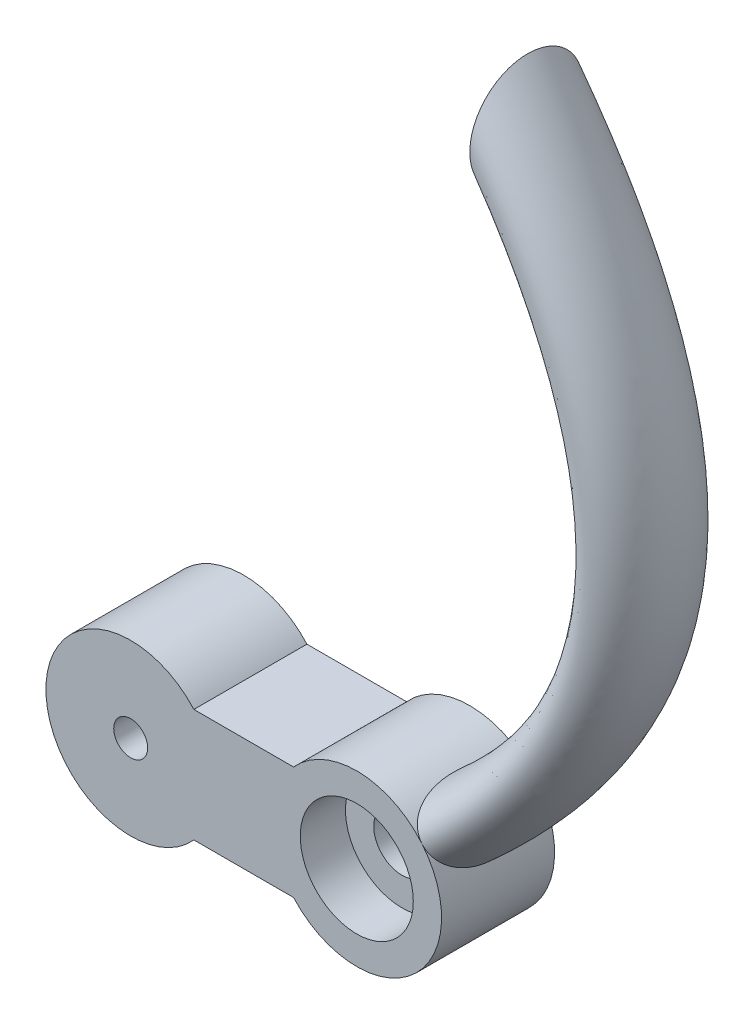
ISO-10303-21;
HEADER;
FILE_DESCRIPTION(('STEP AP214'),'2;1');
FILE_NAME('part.step','',(''),(''),'','','');
FILE_SCHEMA(('AUTOMOTIVE_DESIGN { 1 0 10303 214 1 1 1 1 }'));
ENDSEC;
DATA;
#1=APPLICATION_CONTEXT('core data for automotive mechanical design processes');
#2=APPLICATION_PROTOCOL_DEFINITION('international standard','automotive_design',2000,#1);
#3=PRODUCT_CONTEXT('',#1,'mechanical');
#4=PRODUCT('Part','Part','',(#3));
#5=PRODUCT_RELATED_PRODUCT_CATEGORY('part','',(#4));
#6=PRODUCT_DEFINITION_FORMATION('','',#4);
#7=PRODUCT_DEFINITION_CONTEXT('part definition',#1,'design');
#8=PRODUCT_DEFINITION('design','',#6,#7);
#9=PRODUCT_DEFINITION_SHAPE('','',#8);
#10=(LENGTH_UNIT() NAMED_UNIT(*) SI_UNIT(.MILLI.,.METRE.));
#11=(NAMED_UNIT(*) PLANE_ANGLE_UNIT() SI_UNIT($,.RADIAN.));
#12=(NAMED_UNIT(*) SI_UNIT($,.STERADIAN.) SOLID_ANGLE_UNIT());
#13=UNCERTAINTY_MEASURE_WITH_UNIT(LENGTH_MEASURE(1.E-05),#10,'distance_accuracy_value','');
#14=(GEOMETRIC_REPRESENTATION_CONTEXT(3) GLOBAL_UNCERTAINTY_ASSIGNED_CONTEXT((#13)) GLOBAL_UNIT_ASSIGNED_CONTEXT((#10,
#11,#12)) REPRESENTATION_CONTEXT('',''));
#15=CARTESIAN_POINT('',(0.,0.,0.));
#16=DIRECTION('',(0.,0.,1.));
#17=DIRECTION('',(1.,0.,0.));
#18=AXIS2_PLACEMENT_3D('',#15,#16,#17);
#19=CARTESIAN_POINT('',(10.,0.,5.));
#20=DIRECTION('',(0.,0.,-1.));
#21=DIRECTION('',(-1.,0.,0.));
#22=AXIS2_PLACEMENT_3D('',#19,#20,#21);
#23=CYLINDRICAL_SURFACE('',#22,2.5);
#24=CARTESIAN_POINT('',(10.,0.,1.));
#25=DIRECTION('',(0.,0.,1.));
#26=DIRECTION('',(1.,0.,0.));
#27=AXIS2_PLACEMENT_3D('',#24,#25,#26);
#28=CIRCLE('',#27,2.5);
#29=CARTESIAN_POINT('',(12.5,0.,1.));
#30=VERTEX_POINT('',#29);
#31=EDGE_CURVE('E99',#30,#30,#28,.T.);
#32=ORIENTED_EDGE('',*,*,#31,.T.);
#33=EDGE_LOOP('',(#32));
#34=FACE_BOUND('',#33,.T.);
#35=CARTESIAN_POINT('',(10.,0.,-5.));
#36=DIRECTION('',(0.,0.,1.));
#37=DIRECTION('',(1.,0.,0.));
#38=AXIS2_PLACEMENT_3D('',#35,#36,#37);
#39=CIRCLE('',#38,2.5);
#40=CARTESIAN_POINT('',(12.5,0.,-5.));
#41=VERTEX_POINT('',#40);
#42=EDGE_CURVE('E198',#41,#41,#39,.T.);
#43=ORIENTED_EDGE('',*,*,#42,.F.);
#44=EDGE_LOOP('',(#43));
#45=FACE_BOUND('',#44,.T.);
#46=ADVANCED_FACE('F36',(#34,#45),#23,.F.);
#47=CARTESIAN_POINT('',(10.,0.,5.));
#48=DIRECTION('',(0.,0.,-1.));
#49=DIRECTION('',(-1.,0.,0.));
#50=AXIS2_PLACEMENT_3D('',#47,#48,#49);
#51=CYLINDRICAL_SURFACE('',#50,7.5);
#52=CARTESIAN_POINT('',(10.,0.,5.));
#53=DIRECTION('',(0.,0.,1.));
#54=DIRECTION('',(1.,0.,0.));
#55=AXIS2_PLACEMENT_3D('',#52,#53,#54);
#56=CIRCLE('',#55,7.5);
#57=CARTESIAN_POINT('',(15.7694044749905,4.79207387296563,5.));
#58=VERTEX_POINT('',#57);
#59=CARTESIAN_POINT('',(4.40983005625052,5.,5.));
#60=VERTEX_POINT('',#59);
#61=EDGE_CURVE('E60',#58,#60,#56,.T.);
#62=ORIENTED_EDGE('',*,*,#61,.F.);
#63=CARTESIAN_POINT('',(15.7694044749901,4.7920738729637,5.));
#64=CARTESIAN_POINT('',(15.7360705742699,4.83220729680182,5.00000237724048));
#65=CARTESIAN_POINT('',(15.7023238251322,4.87198180652238,4.99775538170766));
#66=CARTESIAN_POINT('',(15.6342598605848,4.950536726728,4.98875693076937));
#67=CARTESIAN_POINT('',(15.5999425800358,4.98931702239794,4.98200495752584));
#68=CARTESIAN_POINT('',(15.5310230473899,5.06561232602957,4.96407519487218));
#69=CARTESIAN_POINT('',(15.496420665983,5.10312671549396,4.9528952750798));
#70=CARTESIAN_POINT('',(15.4272327826365,5.17664931994343,4.92629932449634));
#71=CARTESIAN_POINT('',(15.392647292964,5.21265692718187,4.91088160304595));
#72=CARTESIAN_POINT('',(15.2898029991921,5.31766041125311,4.8588776206783));
#73=CARTESIAN_POINT('',(15.2219431406473,5.38420164073377,4.81640206713148));
#74=CARTESIAN_POINT('',(15.0890460374641,5.50999416824557,4.71823006404527));
#75=CARTESIAN_POINT('',(15.024013653487,5.56923321088768,4.66251183581868));
#76=CARTESIAN_POINT('',(14.9121201649788,5.66791969578116,4.5543404313291));
#77=CARTESIAN_POINT('',(14.864470128819,5.70881671927045,4.50398775548582));
#78=CARTESIAN_POINT('',(14.7717967270433,5.78650237518905,4.39810298029026));
#79=CARTESIAN_POINT('',(14.7267710294031,5.82329468255169,4.34257559693056));
#80=CARTESIAN_POINT('',(14.6393005711655,5.89321942375637,4.22707148691278));
#81=CARTESIAN_POINT('',(14.5968632450052,5.92634151968345,4.16708294982884));
#82=CARTESIAN_POINT('',(14.5147185644239,5.98915582320375,4.04353721645728));
#83=CARTESIAN_POINT('',(14.4750121226916,6.01884688634512,3.97997883986263));
#84=CARTESIAN_POINT('',(14.3743754249286,6.09268626841556,3.80933888890256));
#85=CARTESIAN_POINT('',(14.3156606550708,6.13429619514976,3.69984493754626));
#86=CARTESIAN_POINT('',(14.2051244124372,6.21059026948541,3.47512363616471));
#87=CARTESIAN_POINT('',(14.1533066020508,6.24527074230227,3.35989328429343));
#88=CARTESIAN_POINT('',(14.0561958465296,6.3087752011365,3.12498228428473));
#89=CARTESIAN_POINT('',(14.0109117293368,6.33759128470812,3.00529588489212));
#90=CARTESIAN_POINT('',(13.9266349340324,6.39014822253349,2.76262433742069));
#91=CARTESIAN_POINT('',(13.8876444300444,6.41388732386424,2.63963806644143));
#92=CARTESIAN_POINT('',(13.7935649811109,6.47020060193488,2.31475088207338));
#93=CARTESIAN_POINT('',(13.7433168757188,6.49923333738147,2.11082076846375));
#94=CARTESIAN_POINT('',(13.6576449075285,6.54782627951535,1.69872733082844));
#95=CARTESIAN_POINT('',(13.6222297729164,6.56738091004914,1.49056158975005));
#96=CARTESIAN_POINT('',(13.5656074352092,6.59829401625841,1.07131312672707));
#97=CARTESIAN_POINT('',(13.5444276286704,6.60963669085726,0.860225573514235));
#98=CARTESIAN_POINT('',(13.5160504389127,6.62477487368972,0.436909342889056));
#99=CARTESIAN_POINT('',(13.508849858629,6.62857210757885,0.224680937527231));
#100=CARTESIAN_POINT('',(13.5082970558608,6.62886541013109,-0.208042998011771));
#101=CARTESIAN_POINT('',(13.5154931273328,6.62507240451214,-0.428539717129851));
#102=CARTESIAN_POINT('',(13.5449662126432,6.60934915104796,-0.868315814337598));
#103=CARTESIAN_POINT('',(13.5672481791782,6.59741623086055,-1.08759476879213));
#104=CARTESIAN_POINT('',(13.6271930419613,6.56465106363896,-1.52270206037956));
#105=CARTESIAN_POINT('',(13.6648074830864,6.5438468430549,-1.73853906233697));
#106=CARTESIAN_POINT('',(13.7560531939875,6.49190502603657,-2.16539761524114));
#107=CARTESIAN_POINT('',(13.809671431472,6.46077583519778,-2.37642293453028));
#108=CARTESIAN_POINT('',(13.9315011143347,6.38734668644009,-2.78295057069135));
#109=CARTESIAN_POINT('',(13.9990421130395,6.34554403812623,-2.97873609977285));
#110=CARTESIAN_POINT('',(14.1130228191281,6.27176647369967,-3.26449598134305));
#111=CARTESIAN_POINT('',(14.1531390564861,6.24532068726002,-3.35845110760991));
#112=CARTESIAN_POINT('',(14.2377760275465,6.18820431771062,-3.54304917265364));
#113=CARTESIAN_POINT('',(14.2822961552163,6.15753431568052,-3.63369256482377));
#114=CARTESIAN_POINT('',(14.3680236132018,6.09693680301037,-3.7958831081099));
#115=CARTESIAN_POINT('',(14.4085272518486,6.06775322601991,-3.86807648932127));
#116=CARTESIAN_POINT('',(14.4927503445434,6.00565793862355,-4.00889454123532));
#117=CARTESIAN_POINT('',(14.5364706668637,5.97274522031492,-4.07751823978581));
#118=CARTESIAN_POINT('',(14.6723993505548,5.86786435251672,-4.27663204152525));
#119=CARTESIAN_POINT('',(14.7695875693868,5.78960778344394,-4.40077586502337));
#120=CARTESIAN_POINT('',(14.9412766646349,5.64285753012954,-4.58516601165053));
#121=CARTESIAN_POINT('',(15.0124414187169,5.57990521444296,-4.65287254407982));
#122=CARTESIAN_POINT('',(15.1221815352843,5.47866149614982,-4.74283705794195));
#123=CARTESIAN_POINT('',(15.159226804485,5.44381106333318,-4.7708732740929));
#124=CARTESIAN_POINT('',(15.2341043907137,5.37185658459617,-4.82264960957925));
#125=CARTESIAN_POINT('',(15.271936329151,5.33475360694927,-4.84639174445812));
#126=CARTESIAN_POINT('',(15.3477868487051,5.25871040804303,-4.88895864833734));
#127=CARTESIAN_POINT('',(15.3858012089766,5.21978818858261,-4.90782295788634));
#128=CARTESIAN_POINT('',(15.4620030646276,5.13999667602533,-4.94051763218561));
#129=CARTESIAN_POINT('',(15.5001906282308,5.09912654190484,-4.95434579987386));
#130=CARTESIAN_POINT('',(15.5710643081979,5.02151451627252,-4.97512529929515));
#131=CARTESIAN_POINT('',(15.6037807356745,4.98498359128032,-4.9827632857917));
#132=CARTESIAN_POINT('',(15.6687876674215,4.91093484007519,-4.99398912326325));
#133=CARTESIAN_POINT('',(15.7010780953748,4.87341684053951,-4.99757625801667));
#134=CARTESIAN_POINT('',(15.7969753351866,4.75971224708958,-5.00219959928699));
#135=CARTESIAN_POINT('',(15.8596137272951,4.68236890945907,-4.99709938730061));
#136=CARTESIAN_POINT('',(15.9806913031794,4.5267123233976,-4.97131779004542));
#137=CARTESIAN_POINT('',(16.0391154556434,4.44839666849187,-4.9505833872398));
#138=CARTESIAN_POINT('',(16.1507041649268,4.29278732748403,-4.89529794135457));
#139=CARTESIAN_POINT('',(16.2038609116861,4.21549530189426,-4.86072675367747));
#140=CARTESIAN_POINT('',(16.2914384697034,4.08318185823935,-4.79046364900805));
#141=CARTESIAN_POINT('',(16.327142871011,4.02758365557693,-4.75738800075506));
#142=CARTESIAN_POINT('',(16.3954765964597,3.91816702604437,-4.68576012466214));
#143=CARTESIAN_POINT('',(16.4281086444641,3.86434705066018,-4.64721282535048));
#144=CARTESIAN_POINT('',(16.5217922679563,3.70558531428068,-4.52427721772605));
#145=CARTESIAN_POINT('',(16.5784863783052,3.60356414042665,-4.43271831673645));
#146=CARTESIAN_POINT('',(16.6690520187371,3.43230425997055,-4.25973689689905));
#147=CARTESIAN_POINT('',(16.7051195751152,3.36113120690249,-4.18127310683882));
#148=CARTESIAN_POINT('',(16.7721509176045,3.22394131074057,-4.01785898154596));
#149=CARTESIAN_POINT('',(16.8031125765543,3.15792662266244,-3.93290596430192));
#150=CARTESIAN_POINT('',(16.8605837947058,3.03104756454103,-3.75764976067525));
#151=CARTESIAN_POINT('',(16.8870869702955,2.97019064011982,-3.66733914925288));
#152=CARTESIAN_POINT('',(16.93616914576,2.85369039819319,-3.48237985993049));
#153=CARTESIAN_POINT('',(16.9587470218858,2.79804857578038,-3.38772994952828));
#154=CARTESIAN_POINT('',(17.0106057008888,2.66619552774649,-3.14799250802819));
#155=CARTESIAN_POINT('',(17.037818756946,2.59311360248537,-3.00072795907952));
#156=CARTESIAN_POINT('',(17.0860256192227,2.45832381963131,-2.70008366924021));
#157=CARTESIAN_POINT('',(17.1070166208278,2.39662109597679,-2.54670120591124));
#158=CARTESIAN_POINT('',(17.1438237188676,2.28456995032729,-2.23520430603324));
#159=CARTESIAN_POINT('',(17.1596383030126,2.23422484779245,-2.07708850133834));
#160=CARTESIAN_POINT('',(17.1868919114098,2.14493840645235,-1.75733917594015));
#161=CARTESIAN_POINT('',(17.1983315298116,2.10599551931816,-1.59570613605439));
#162=CARTESIAN_POINT('',(17.2177051374383,2.03862603074903,-1.26536850100332));
#163=CARTESIAN_POINT('',(17.225533025455,2.01052127769755,-1.09659214266593));
#164=CARTESIAN_POINT('',(17.2376513039045,1.96644981283084,-0.757336157585519));
#165=CARTESIAN_POINT('',(17.2419415697484,1.9504835285127,-0.586856471068271));
#166=CARTESIAN_POINT('',(17.2472340399364,1.93072635404102,-0.245071752989593));
#167=CARTESIAN_POINT('',(17.2482348892131,1.92694048159273,-0.0737664103951227));
#168=CARTESIAN_POINT('',(17.2470026861844,1.93156799100294,0.268669934495325));
#169=CARTESIAN_POINT('',(17.2447695046234,1.93998186045263,0.439800929549537));
#170=CARTESIAN_POINT('',(17.2364022504926,1.97098628990027,0.804447161388899));
#171=CARTESIAN_POINT('',(17.2297736369942,1.99536847595489,0.997801859033202));
#172=CARTESIAN_POINT('',(17.2116715150376,2.05983335873069,1.38170713077285));
#173=CARTESIAN_POINT('',(17.2001966811933,2.09992035032001,1.57225692299432));
#174=CARTESIAN_POINT('',(17.1715763651956,2.19567501037321,1.94883095786881));
#175=CARTESIAN_POINT('',(17.1544349733825,2.25133143577552,2.13485836127637));
#176=CARTESIAN_POINT('',(17.1132792682572,2.37817505006549,2.50071004400531));
#177=CARTESIAN_POINT('',(17.0892689877121,2.44935312028704,2.68053789391088));
#178=CARTESIAN_POINT('',(17.0439040618364,2.57603692687642,2.96234670664953));
#179=CARTESIAN_POINT('',(17.0252514459232,2.62661573805311,3.06700064098704));
#180=CARTESIAN_POINT('',(16.9843635533765,2.73348571334548,3.27261549722381));
#181=CARTESIAN_POINT('',(16.9621292085547,2.78977539033344,3.37357737127861));
#182=CARTESIAN_POINT('',(16.9135657625219,2.90803902156832,3.57093879385311));
#183=CARTESIAN_POINT('',(16.8872417454087,2.97000587947508,3.66734381574725));
#184=CARTESIAN_POINT('',(16.8298596416592,3.09968353109019,3.85469135973373));
#185=CARTESIAN_POINT('',(16.7988031512846,3.16739238462285,3.94563570934396));
#186=CARTESIAN_POINT('',(16.7181130350588,3.33598521761579,4.15485296295627));
#187=CARTESIAN_POINT('',(16.6659454923903,3.43955274387845,4.27004885117847));
#188=CARTESIAN_POINT('',(16.5489455855814,3.65739406073176,4.48265713742125));
#189=CARTESIAN_POINT('',(16.4841302235882,3.77165337247536,4.58009307332958));
#190=CARTESIAN_POINT('',(16.3590498038969,3.97780354563421,4.72761580315644));
#191=CARTESIAN_POINT('',(16.3021227633146,4.06760819338094,4.78340879994918));
#192=CARTESIAN_POINT('',(16.1801607389554,4.25060068600979,4.87786792695158));
#193=CARTESIAN_POINT('',(16.1151451749953,4.34378006090881,4.91657410141825));
#194=CARTESIAN_POINT('',(16.0029251480228,4.49670298086836,4.96289009370077));
#195=CARTESIAN_POINT('',(15.9579046434066,4.55620957928409,4.97669565746212));
#196=CARTESIAN_POINT('',(15.8653480253328,4.67475441836803,4.99524950540743));
#197=CARTESIAN_POINT('',(15.8178115678926,4.7337925937177,4.99999654779974));
#198=CARTESIAN_POINT('',(15.7694044749901,4.7920738729637,5.));
#199=B_SPLINE_CURVE_WITH_KNOTS('',3,(#63,#64,#65,#66,#67,#68,#69,#70,#71,#72,#73,#74,#75,#76,
#77,#78,#79,#80,#81,#82,#83,#84,#85,#86,#87,#88,#89,#90,#91,#92,#93,#94,#95,#96,#97,#98,#99,
#100,#101,#102,#103,#104,#105,#106,#107,#108,#109,#110,#111,#112,#113,#114,#115,#116,#117,#118,
#119,#120,#121,#122,#123,#124,#125,#126,#127,#128,#129,#130,#131,#132,#133,#134,#135,#136,#137,
#138,#139,#140,#141,#142,#143,#144,#145,#146,#147,#148,#149,#150,#151,#152,#153,#154,#155,#156,
#157,#158,#159,#160,#161,#162,#163,#164,#165,#166,#167,#168,#169,#170,#171,#172,#173,#174,#175,
#176,#177,#178,#179,#180,#181,#182,#183,#184,#185,#186,#187,#188,#189,#190,#191,#192,#193,#194,
#195,#196,#197,#198),.UNSPECIFIED.,.T.,.F.,(4,2,2,2,2,2,2,2,2,2,2,2,2,2,2,2,2,2,2,2,2,2,2,2,2,2,
2,2,2,2,2,2,2,2,2,2,2,2,2,2,2,2,2,2,2,2,2,2,2,2,2,2,2,2,2,2,2,2,2,2,2,2,2,2,2,2,2,4),(0.,
0.156439971337123,0.31289792823076,0.469431252100811,0.626027115376447,0.936921934596182,
1.24833162809643,1.48946883562876,1.73038839165291,1.9719701658675,2.21363229066556,
2.60607802423842,2.99873132800393,3.39191029096186,3.78522478792438,4.42035605031446,
5.05586052060207,5.69258457347493,6.32916298967416,6.9904467296716,7.65194767434009,
8.31137409257003,8.97026498167302,9.60276781706127,9.91917093117886,10.2355305645319,
10.498641241557,10.7618232018618,11.2867449305404,11.6354543020296,11.8095057355777,
11.9834752601399,12.1559869085473,12.3285737268101,12.4772873658154,12.6260272944146,
12.923481998799,13.221949972189,13.5208540668264,13.7422332153375,13.963414209711,
14.4066433023103,14.7419692116626,15.0774344697085,15.4133760292471,15.7494136055475,
16.2486014197559,16.7480139037769,17.2475721611313,17.7470625510069,18.2604150993035,
18.7737857262027,19.2873678084209,19.8009704177123,20.3852542560413,20.9696979929257,
21.5537207736127,22.137401372128,22.4903564120593,22.843219776132,23.1956479354692,
23.5479574829553,24.0368764773258,24.5251427023578,24.8841464250431,25.2423042699963,
25.469453393202,25.6966336530152),.UNSPECIFIED.);
#200=CARTESIAN_POINT('',(15.7694043249585,4.79207405359617,-4.99999999999998));
#201=VERTEX_POINT('',#200);
#202=EDGE_CURVE('E51',#58,#201,#199,.T.);
#203=ORIENTED_EDGE('',*,*,#202,.T.);
#204=CARTESIAN_POINT('',(10.,0.,-5.));
#205=DIRECTION('',(0.,0.,1.));
#206=DIRECTION('',(1.,0.,0.));
#207=AXIS2_PLACEMENT_3D('',#204,#205,#206);
#208=CIRCLE('',#207,7.5);
#209=CARTESIAN_POINT('',(4.40983005625052,5.,-5.));
#210=VERTEX_POINT('',#209);
#211=EDGE_CURVE('E81',#201,#210,#208,.T.);
#212=ORIENTED_EDGE('',*,*,#211,.T.);
#213=DIRECTION('',(0.,0.,-1.));
#214=VECTOR('',#213,1.);
#215=CARTESIAN_POINT('',(4.40983005625052,5.,5.));
#216=LINE('',#215,#214);
#217=EDGE_CURVE('E190',#60,#210,#216,.T.);
#218=ORIENTED_EDGE('',*,*,#217,.F.);
#219=EDGE_LOOP('',(#62,#203,#212,#218));
#220=FACE_BOUND('',#219,.T.);
#221=ADVANCED_FACE('F152',(#220),#51,.T.);
#222=CARTESIAN_POINT('',(-10.,0.,5.));
#223=DIRECTION('',(0.,0.,-1.));
#224=DIRECTION('',(-1.,0.,0.));
#225=AXIS2_PLACEMENT_3D('',#222,#223,#224);
#226=CYLINDRICAL_SURFACE('',#225,1.5);
#227=CARTESIAN_POINT('',(-10.,0.,5.));
#228=DIRECTION('',(0.,0.,1.));
#229=DIRECTION('',(1.,0.,0.));
#230=AXIS2_PLACEMENT_3D('',#227,#228,#229);
#231=CIRCLE('',#230,1.5);
#232=CARTESIAN_POINT('',(-8.5,0.,5.));
#233=VERTEX_POINT('',#232);
#234=EDGE_CURVE('E189',#233,#233,#231,.T.);
#235=ORIENTED_EDGE('',*,*,#234,.T.);
#236=EDGE_LOOP('',(#235));
#237=FACE_BOUND('',#236,.T.);
#238=CARTESIAN_POINT('',(-10.,0.,-1.));
#239=DIRECTION('',(0.,0.,-1.));
#240=DIRECTION('',(-1.,0.,0.));
#241=AXIS2_PLACEMENT_3D('',#238,#239,#240);
#242=CIRCLE('',#241,1.5);
#243=CARTESIAN_POINT('',(-11.5,0.,-1.));
#244=VERTEX_POINT('',#243);
#245=EDGE_CURVE('E40',#244,#244,#242,.T.);
#246=ORIENTED_EDGE('',*,*,#245,.T.);
#247=EDGE_LOOP('',(#246));
#248=FACE_BOUND('',#247,.T.);
#249=ADVANCED_FACE('F38',(#237,#248),#226,.F.);
#250=CARTESIAN_POINT('',(0.,5.,5.));
#251=DIRECTION('',(0.,-1.,0.));
#252=DIRECTION('',(1.,0.,0.));
#253=AXIS2_PLACEMENT_3D('',#250,#251,#252);
#254=PLANE('',#253);
#255=DIRECTION('',(-1.,0.,0.));
#256=VECTOR('',#255,1.);
#257=CARTESIAN_POINT('',(0.,5.,-5.));
#258=LINE('',#257,#256);
#259=CARTESIAN_POINT('',(-4.40983005625053,5.,-5.));
#260=VERTEX_POINT('',#259);
#261=EDGE_CURVE('E184',#210,#260,#258,.T.);
#262=ORIENTED_EDGE('',*,*,#261,.T.);
#263=DIRECTION('',(0.,0.,-1.));
#264=VECTOR('',#263,1.);
#265=CARTESIAN_POINT('',(-4.40983005625053,5.,5.));
#266=LINE('',#265,#264);
#267=CARTESIAN_POINT('',(-4.40983005625053,5.,5.));
#268=VERTEX_POINT('',#267);
#269=EDGE_CURVE('E11',#268,#260,#266,.T.);
#270=ORIENTED_EDGE('',*,*,#269,.F.);
#271=DIRECTION('',(-1.,0.,0.));
#272=VECTOR('',#271,1.);
#273=CARTESIAN_POINT('',(0.,5.,5.));
#274=LINE('',#273,#272);
#275=EDGE_CURVE('E206',#60,#268,#274,.T.);
#276=ORIENTED_EDGE('',*,*,#275,.F.);
#277=ORIENTED_EDGE('',*,*,#217,.T.);
#278=EDGE_LOOP('',(#262,#270,#276,#277));
#279=FACE_BOUND('',#278,.T.);
#280=ADVANCED_FACE('F159',(#279),#254,.F.);
#281=CARTESIAN_POINT('',(-10.,0.,5.));
#282=DIRECTION('',(0.,0.,-1.));
#283=DIRECTION('',(-1.,0.,0.));
#284=AXIS2_PLACEMENT_3D('',#281,#282,#283);
#285=CYLINDRICAL_SURFACE('',#284,7.5);
#286=CARTESIAN_POINT('',(-10.,0.,-5.));
#287=DIRECTION('',(0.,0.,1.));
#288=DIRECTION('',(1.,0.,0.));
#289=AXIS2_PLACEMENT_3D('',#286,#287,#288);
#290=CIRCLE('',#289,7.5);
#291=CARTESIAN_POINT('',(-4.40983005625053,-5.,-5.));
#292=VERTEX_POINT('',#291);
#293=EDGE_CURVE('E180',#260,#292,#290,.T.);
#294=ORIENTED_EDGE('',*,*,#293,.T.);
#295=DIRECTION('',(0.,0.,-1.));
#296=VECTOR('',#295,1.);
#297=CARTESIAN_POINT('',(-4.40983005625053,-5.,5.));
#298=LINE('',#297,#296);
#299=CARTESIAN_POINT('',(-4.40983005625053,-5.,5.));
#300=VERTEX_POINT('',#299);
#301=EDGE_CURVE('E45',#300,#292,#298,.T.);
#302=ORIENTED_EDGE('',*,*,#301,.F.);
#303=CARTESIAN_POINT('',(-10.,0.,5.));
#304=DIRECTION('',(0.,0.,1.));
#305=DIRECTION('',(1.,0.,0.));
#306=AXIS2_PLACEMENT_3D('',#303,#304,#305);
#307=CIRCLE('',#306,7.5);
#308=EDGE_CURVE('E88',#268,#300,#307,.T.);
#309=ORIENTED_EDGE('',*,*,#308,.F.);
#310=ORIENTED_EDGE('',*,*,#269,.T.);
#311=EDGE_LOOP('',(#294,#302,#309,#310));
#312=FACE_BOUND('',#311,.T.);
#313=ADVANCED_FACE('F162',(#312),#285,.T.);
#314=CARTESIAN_POINT('',(0.,-5.,5.));
#315=DIRECTION('',(0.,-1.,0.));
#316=DIRECTION('',(0.,0.,-1.));
#317=AXIS2_PLACEMENT_3D('',#314,#315,#316);
#318=PLANE('',#317);
#319=DIRECTION('',(-1.,0.,0.));
#320=VECTOR('',#319,1.);
#321=CARTESIAN_POINT('',(0.,-5.,-5.));
#322=LINE('',#321,#320);
#323=CARTESIAN_POINT('',(4.40983005625053,-5.,-5.));
#324=VERTEX_POINT('',#323);
#325=EDGE_CURVE('E174',#324,#292,#322,.T.);
#326=ORIENTED_EDGE('',*,*,#325,.F.);
#327=DIRECTION('',(0.,0.,-1.));
#328=VECTOR('',#327,1.);
#329=CARTESIAN_POINT('',(4.40983005625053,-5.,5.));
#330=LINE('',#329,#328);
#331=CARTESIAN_POINT('',(4.40983005625053,-5.,5.));
#332=VERTEX_POINT('',#331);
#333=EDGE_CURVE('E176',#332,#324,#330,.T.);
#334=ORIENTED_EDGE('',*,*,#333,.F.);
#335=DIRECTION('',(-1.,0.,0.));
#336=VECTOR('',#335,1.);
#337=CARTESIAN_POINT('',(0.,-5.,5.));
#338=LINE('',#337,#336);
#339=EDGE_CURVE('E203',#332,#300,#338,.T.);
#340=ORIENTED_EDGE('',*,*,#339,.T.);
#341=ORIENTED_EDGE('',*,*,#301,.T.);
#342=EDGE_LOOP('',(#326,#334,#340,#341));
#343=FACE_BOUND('',#342,.T.);
#344=ADVANCED_FACE('F165',(#343),#318,.T.);
#345=EDGE_CURVE('E182',#324,#201,#208,.T.);
#346=ORIENTED_EDGE('',*,*,#345,.T.);
#347=EDGE_CURVE('E98',#201,#58,#199,.T.);
#348=ORIENTED_EDGE('',*,*,#347,.T.);
#349=EDGE_CURVE('E192',#332,#58,#56,.T.);
#350=ORIENTED_EDGE('',*,*,#349,.F.);
#351=ORIENTED_EDGE('',*,*,#333,.T.);
#352=EDGE_LOOP('',(#346,#348,#350,#351));
#353=FACE_BOUND('',#352,.T.);
#354=ADVANCED_FACE('F114',(#353),#51,.T.);
#355=CARTESIAN_POINT('',(0.,0.,5.));
#356=DIRECTION('',(0.,0.,1.));
#357=DIRECTION('',(1.,0.,0.));
#358=AXIS2_PLACEMENT_3D('',#355,#356,#357);
#359=PLANE('',#358);
#360=CARTESIAN_POINT('',(10.,0.,5.));
#361=DIRECTION('',(0.,0.,1.));
#362=DIRECTION('',(1.,0.,0.));
#363=AXIS2_PLACEMENT_3D('',#360,#361,#362);
#364=CIRCLE('',#363,5.);
#365=CARTESIAN_POINT('',(15.,0.,5.));
#366=VERTEX_POINT('',#365);
#367=EDGE_CURVE('E315',#366,#366,#364,.T.);
#368=ORIENTED_EDGE('',*,*,#367,.F.);
#369=EDGE_LOOP('',(#368));
#370=FACE_BOUND('',#369,.T.);
#371=ORIENTED_EDGE('',*,*,#349,.T.);
#372=ORIENTED_EDGE('',*,*,#61,.T.);
#373=ORIENTED_EDGE('',*,*,#275,.T.);
#374=ORIENTED_EDGE('',*,*,#308,.T.);
#375=ORIENTED_EDGE('',*,*,#339,.F.);
#376=EDGE_LOOP('',(#371,#372,#373,#374,#375));
#377=FACE_BOUND('',#376,.T.);
#378=ORIENTED_EDGE('',*,*,#234,.F.);
#379=EDGE_LOOP('',(#378));
#380=FACE_BOUND('',#379,.T.);
#381=ADVANCED_FACE('F143',(#370,#377,#380),#359,.T.);
#382=CARTESIAN_POINT('',(0.,0.,-5.));
#383=DIRECTION('',(0.,0.,1.));
#384=DIRECTION('',(1.,0.,0.));
#385=AXIS2_PLACEMENT_3D('',#382,#383,#384);
#386=PLANE('',#385);
#387=ORIENTED_EDGE('',*,*,#211,.F.);
#388=ORIENTED_EDGE('',*,*,#345,.F.);
#389=ORIENTED_EDGE('',*,*,#325,.T.);
#390=ORIENTED_EDGE('',*,*,#293,.F.);
#391=ORIENTED_EDGE('',*,*,#261,.F.);
#392=EDGE_LOOP('',(#387,#388,#389,#390,#391));
#393=FACE_BOUND('',#392,.T.);
#394=CARTESIAN_POINT('',(-10.,0.,-5.));
#395=DIRECTION('',(0.,0.,-1.));
#396=DIRECTION('',(-1.,0.,0.));
#397=AXIS2_PLACEMENT_3D('',#394,#395,#396);
#398=CIRCLE('',#397,5.);
#399=CARTESIAN_POINT('',(-15.,0.,-5.));
#400=VERTEX_POINT('',#399);
#401=EDGE_CURVE('E209',#400,#400,#398,.T.);
#402=ORIENTED_EDGE('',*,*,#401,.F.);
#403=EDGE_LOOP('',(#402));
#404=FACE_BOUND('',#403,.T.);
#405=ORIENTED_EDGE('',*,*,#42,.T.);
#406=EDGE_LOOP('',(#405));
#407=FACE_BOUND('',#406,.T.);
#408=ADVANCED_FACE('F141',(#393,#404,#407),#386,.F.);
#409=CARTESIAN_POINT('',(-10.,0.,-1.));
#410=DIRECTION('',(0.,0.,-1.));
#411=DIRECTION('',(-1.,0.,0.));
#412=AXIS2_PLACEMENT_3D('',#409,#410,#411);
#413=CYLINDRICAL_SURFACE('',#412,5.);
#414=CARTESIAN_POINT('',(-10.,0.,-1.));
#415=DIRECTION('',(0.,0.,-1.));
#416=DIRECTION('',(-1.,0.,0.));
#417=AXIS2_PLACEMENT_3D('',#414,#415,#416);
#418=CIRCLE('',#417,5.);
#419=CARTESIAN_POINT('',(-15.,0.,-1.));
#420=VERTEX_POINT('',#419);
#421=EDGE_CURVE('E112',#420,#420,#418,.T.);
#422=ORIENTED_EDGE('',*,*,#421,.F.);
#423=EDGE_LOOP('',(#422));
#424=FACE_BOUND('',#423,.T.);
#425=ORIENTED_EDGE('',*,*,#401,.T.);
#426=EDGE_LOOP('',(#425));
#427=FACE_BOUND('',#426,.T.);
#428=ADVANCED_FACE('F137',(#424,#427),#413,.F.);
#429=CARTESIAN_POINT('',(-10.,0.,-1.));
#430=DIRECTION('',(0.,0.,-1.));
#431=DIRECTION('',(-1.,0.,0.));
#432=AXIS2_PLACEMENT_3D('',#429,#430,#431);
#433=PLANE('',#432);
#434=ORIENTED_EDGE('',*,*,#245,.F.);
#435=EDGE_LOOP('',(#434));
#436=FACE_BOUND('',#435,.T.);
#437=ORIENTED_EDGE('',*,*,#421,.T.);
#438=EDGE_LOOP('',(#437));
#439=FACE_BOUND('',#438,.T.);
#440=ADVANCED_FACE('F134',(#436,#439),#433,.T.);
#441=CARTESIAN_POINT('',(20.,60.,0.));
#442=DIRECTION('',(-0.999744705090728,0.0225947923879401,0.));
#443=DIRECTION('',(0.,0.,1.));
#444=AXIS2_PLACEMENT_3D('',#441,#442,#443);
#445=PLANE('',#444);
#446=CARTESIAN_POINT('',(20.,60.,0.));
#447=DIRECTION('',(-0.999744705090728,0.0225947923879401,0.));
#448=DIRECTION('',(0.,0.,1.));
#449=AXIS2_PLACEMENT_3D('',#446,#447,#448);
#450=CIRCLE('',#449,5.);
#451=CARTESIAN_POINT('',(20.,60.,5.));
#452=VERTEX_POINT('',#451);
#453=EDGE_CURVE('E95',#452,#452,#450,.T.);
#454=ORIENTED_EDGE('',*,*,#453,.T.);
#455=EDGE_LOOP('',(#454));
#456=FACE_BOUND('',#455,.T.);
#457=ADVANCED_FACE('F96',(#456),#445,.T.);
#458=CARTESIAN_POINT('',(10.,0.,5.));
#459=CARTESIAN_POINT('',(15.7452428863918,4.34220648551298,5.));
#460=CARTESIAN_POINT('',(20.2625083845958,8.84886134966878,5.));
#461=CARTESIAN_POINT('',(25.1964405493955,15.8555162137947,5.));
#462=CARTESIAN_POINT('',(26.5340902572763,18.2321799298375,5.));
#463=CARTESIAN_POINT('',(28.5954009788793,23.0677315512109,5.));
#464=CARTESIAN_POINT('',(29.3190619926163,25.5266194565636,5.));
#465=CARTESIAN_POINT('',(30.1523953259497,30.5266194565548,5.));
#466=CARTESIAN_POINT('',(30.2620676455503,33.0677315512186,5.));
#467=CARTESIAN_POINT('',(29.8674235906053,38.2321799298298,5.));
#468=CARTESIAN_POINT('',(29.3631072160585,40.8555162137957,5.));
#469=CARTESIAN_POINT('',(26.9291750512697,48.8488613496667,5.));
#470=CARTESIAN_POINT('',(24.078576219732,54.3422064855312,5.));
#471=CARTESIAN_POINT('',(20.,60.,5.));
#472=CARTESIAN_POINT('',(20.,0.,5.));
#473=CARTESIAN_POINT('',(25.745242886626,5.14907315825611,5.));
#474=CARTESIAN_POINT('',(30.1768255610235,10.6791923105475,5.));
#475=CARTESIAN_POINT('',(34.5239451123453,19.5172927974179,5.));
#476=CARTESIAN_POINT('',(35.5857561278351,22.5496702554719,5.));
#477=CARTESIAN_POINT('',(36.8937303353692,28.6989931885811,5.));
#478=CARTESIAN_POINT('',(37.1381664761129,31.8134864191474,5.));
#479=CARTESIAN_POINT('',(36.8513475843656,37.9956976973588,5.));
#480=CARTESIAN_POINT('',(36.3224393137614,41.0602385702913,5.));
#481=CARTESIAN_POINT('',(34.6153501079049,47.0676463577616,5.));
#482=CARTESIAN_POINT('',(33.4403473568711,50.0114308637351,5.));
#483=CARTESIAN_POINT('',(29.1073280734891,58.7014899534701,5.));
#484=CARTESIAN_POINT('',(25.1645332864312,64.3202168465839,5.));
#485=CARTESIAN_POINT('',(20.2259479238794,69.9974470509073,5.));
#486=CARTESIAN_POINT('',(20.,0.,-5.));
#487=CARTESIAN_POINT('',(25.745242886626,5.14907315825611,-5.));
#488=CARTESIAN_POINT('',(30.1768255610235,10.6791923105475,-5.));
#489=CARTESIAN_POINT('',(34.5239451123453,19.5172927974179,-5.));
#490=CARTESIAN_POINT('',(35.5857561278351,22.5496702554719,-5.));
#491=CARTESIAN_POINT('',(36.8937303353692,28.6989931885811,-5.));
#492=CARTESIAN_POINT('',(37.1381664761129,31.8134864191474,-5.));
#493=CARTESIAN_POINT('',(36.8513475843656,37.9956976973588,-5.));
#494=CARTESIAN_POINT('',(36.3224393137614,41.0602385702913,-5.));
#495=CARTESIAN_POINT('',(34.6153501079049,47.0676463577616,-5.));
#496=CARTESIAN_POINT('',(33.4403473568711,50.0114308637351,-5.));
#497=CARTESIAN_POINT('',(29.1073280734891,58.7014899534701,-5.));
#498=CARTESIAN_POINT('',(25.1645332864312,64.3202168465839,-5.));
#499=CARTESIAN_POINT('',(20.2259479238794,69.9974470509073,-5.));
#500=CARTESIAN_POINT('',(10.,0.,-5.));
#501=CARTESIAN_POINT('',(15.7452428863918,4.34220648551298,-5.));
#502=CARTESIAN_POINT('',(20.2625083845958,8.84886134966878,-5.));
#503=CARTESIAN_POINT('',(25.1964405493955,15.8555162137947,-5.));
#504=CARTESIAN_POINT('',(26.5340902572763,18.2321799298375,-5.));
#505=CARTESIAN_POINT('',(28.5954009788793,23.0677315512109,-5.));
#506=CARTESIAN_POINT('',(29.3190619926163,25.5266194565636,-5.));
#507=CARTESIAN_POINT('',(30.1523953259497,30.5266194565548,-5.));
#508=CARTESIAN_POINT('',(30.2620676455503,33.0677315512186,-5.));
#509=CARTESIAN_POINT('',(29.8674235906053,38.2321799298298,-5.));
#510=CARTESIAN_POINT('',(29.3631072160585,40.8555162137957,-5.));
#511=CARTESIAN_POINT('',(26.9291750512697,48.8488613496667,-5.));
#512=CARTESIAN_POINT('',(24.078576219732,54.3422064855312,-5.));
#513=CARTESIAN_POINT('',(20.,60.,-5.));
#514=CARTESIAN_POINT('',(0.,0.,-5.));
#515=CARTESIAN_POINT('',(5.74524288615752,3.53533981276986,-5.));
#516=CARTESIAN_POINT('',(10.3481912081682,7.01853038879008,-5.));
#517=CARTESIAN_POINT('',(15.8689359864456,12.1937396301715,-5.));
#518=CARTESIAN_POINT('',(17.4824243867176,13.9146896042032,-5.));
#519=CARTESIAN_POINT('',(20.2970716223893,17.4364699138407,-5.));
#520=CARTESIAN_POINT('',(21.4999575091198,19.2397524939797,-5.));
#521=CARTESIAN_POINT('',(23.4534430675337,23.0575412157508,-5.));
#522=CARTESIAN_POINT('',(24.2016959773392,25.075224532146,-5.));
#523=CARTESIAN_POINT('',(25.1194970733057,29.3967135018981,-5.));
#524=CARTESIAN_POINT('',(25.2858670752459,31.6996015638564,-5.));
#525=CARTESIAN_POINT('',(24.7510220290504,38.9962327458633,-5.));
#526=CARTESIAN_POINT('',(22.9926191530328,44.3641961244784,-5.));
#527=CARTESIAN_POINT('',(19.7740520761206,50.0025529490927,-5.));
#528=CARTESIAN_POINT('',(0.,0.,5.));
#529=CARTESIAN_POINT('',(5.74524288615752,3.53533981276986,5.));
#530=CARTESIAN_POINT('',(10.3481912081682,7.01853038879008,5.));
#531=CARTESIAN_POINT('',(15.8689359864456,12.1937396301715,5.));
#532=CARTESIAN_POINT('',(17.4824243867176,13.9146896042032,5.));
#533=CARTESIAN_POINT('',(20.2970716223893,17.4364699138407,5.));
#534=CARTESIAN_POINT('',(21.4999575091198,19.2397524939797,5.));
#535=CARTESIAN_POINT('',(23.4534430675337,23.0575412157508,5.));
#536=CARTESIAN_POINT('',(24.2016959773392,25.075224532146,5.));
#537=CARTESIAN_POINT('',(25.1194970733057,29.3967135018981,5.));
#538=CARTESIAN_POINT('',(25.2858670752459,31.6996015638564,5.));
#539=CARTESIAN_POINT('',(24.7510220290504,38.9962327458633,5.));
#540=CARTESIAN_POINT('',(22.9926191530328,44.3641961244784,5.));
#541=CARTESIAN_POINT('',(19.7740520761206,50.0025529490927,5.));
#542=CARTESIAN_POINT('',(10.,0.,5.));
#543=CARTESIAN_POINT('',(15.7452428863918,4.34220648551298,5.));
#544=CARTESIAN_POINT('',(20.2625083845958,8.84886134966878,5.));
#545=CARTESIAN_POINT('',(25.1964405493955,15.8555162137947,5.));
#546=CARTESIAN_POINT('',(26.5340902572763,18.2321799298375,5.));
#547=CARTESIAN_POINT('',(28.5954009788793,23.0677315512109,5.));
#548=CARTESIAN_POINT('',(29.3190619926163,25.5266194565636,5.));
#549=CARTESIAN_POINT('',(30.1523953259497,30.5266194565548,5.));
#550=CARTESIAN_POINT('',(30.2620676455503,33.0677315512186,5.));
#551=CARTESIAN_POINT('',(29.8674235906053,38.2321799298298,5.));
#552=CARTESIAN_POINT('',(29.3631072160585,40.8555162137957,5.));
#553=CARTESIAN_POINT('',(26.9291750512697,48.8488613496667,5.));
#554=CARTESIAN_POINT('',(24.078576219732,54.3422064855312,5.));
#555=CARTESIAN_POINT('',(20.,60.,5.));
#556=(BOUNDED_SURFACE() B_SPLINE_SURFACE(3,3,((#458,#459,#460,#461,#462,#463,#464,#465,#466,
#467,#468,#469,#470,#471),(#472,#473,#474,#475,#476,#477,#478,#479,#480,#481,#482,#483,#484,
#485),(#486,#487,#488,#489,#490,#491,#492,#493,#494,#495,#496,#497,#498,#499),(#500,#501,#502,
#503,#504,#505,#506,#507,#508,#509,#510,#511,#512,#513),(#514,#515,#516,#517,#518,#519,#520,
#521,#522,#523,#524,#525,#526,#527),(#528,#529,#530,#531,#532,#533,#534,#535,#536,#537,#538,
#539,#540,#541),(#542,#543,#544,#545,#546,#547,#548,#549,#550,#551,#552,#553,#554,#555)),
.UNSPECIFIED.,.T.,.F.,.F.) B_SPLINE_SURFACE_WITH_KNOTS((4,3,4),(4,2,2,2,2,2,4),(0.,0.5,1.),(0.,
0.25,0.375,0.5,0.625,0.75,1.),
.UNSPECIFIED.) GEOMETRIC_REPRESENTATION_ITEM() RATIONAL_B_SPLINE_SURFACE(((1.,1.,1.,1.,1.,1.,1.,
1.,1.,1.,1.,1.,1.,1.),(0.333333333333333,0.333333333333333,0.333333333333333,0.333333333333333,
0.333333333333333,0.333333333333333,0.333333333333333,0.333333333333333,0.333333333333333,
0.333333333333333,0.333333333333333,0.333333333333333,0.333333333333333,0.333333333333333),
(0.333333333333333,0.333333333333333,0.333333333333333,0.333333333333333,0.333333333333333,
0.333333333333333,0.333333333333333,0.333333333333333,0.333333333333333,0.333333333333333,
0.333333333333333,0.333333333333333,0.333333333333333,0.333333333333333),(1.,1.,1.,1.,1.,1.,1.,
1.,1.,1.,1.,1.,1.,1.),(0.333333333333333,0.333333333333333,0.333333333333333,0.333333333333333,
0.333333333333333,0.333333333333333,0.333333333333333,0.333333333333333,0.333333333333333,
0.333333333333333,0.333333333333333,0.333333333333333,0.333333333333333,0.333333333333333),
(0.333333333333333,0.333333333333333,0.333333333333333,0.333333333333333,0.333333333333333,
0.333333333333333,0.333333333333333,0.333333333333333,0.333333333333333,0.333333333333333,
0.333333333333333,0.333333333333333,0.333333333333333,0.333333333333333),(1.,1.,1.,1.,1.,1.,1.,
1.,1.,1.,1.,1.,1.,1.))) REPRESENTATION_ITEM('') SURFACE());
#557=ORIENTED_EDGE('',*,*,#453,.F.);
#558=EDGE_LOOP('',(#557));
#559=FACE_BOUND('',#558,.T.);
#560=ORIENTED_EDGE('',*,*,#202,.F.);
#561=ORIENTED_EDGE('',*,*,#347,.F.);
#562=EDGE_LOOP('',(#560,#561));
#563=FACE_BOUND('',#562,.T.);
#564=ADVANCED_FACE('F118',(#559,#563),#556,.T.);
#565=CARTESIAN_POINT('',(10.,0.,1.));
#566=DIRECTION('',(0.,0.,1.));
#567=DIRECTION('',(1.,0.,0.));
#568=AXIS2_PLACEMENT_3D('',#565,#566,#567);
#569=CYLINDRICAL_SURFACE('',#568,5.);
#570=CARTESIAN_POINT('',(10.,0.,1.));
#571=DIRECTION('',(0.,0.,1.));
#572=DIRECTION('',(1.,0.,0.));
#573=AXIS2_PLACEMENT_3D('',#570,#571,#572);
#574=CIRCLE('',#573,5.);
#575=CARTESIAN_POINT('',(15.,0.,1.));
#576=VERTEX_POINT('',#575);
#577=EDGE_CURVE('E103',#576,#576,#574,.T.);
#578=ORIENTED_EDGE('',*,*,#577,.F.);
#579=EDGE_LOOP('',(#578));
#580=FACE_BOUND('',#579,.T.);
#581=ORIENTED_EDGE('',*,*,#367,.T.);
#582=EDGE_LOOP('',(#581));
#583=FACE_BOUND('',#582,.T.);
#584=ADVANCED_FACE('F125',(#580,#583),#569,.F.);
#585=CARTESIAN_POINT('',(10.,0.,1.));
#586=DIRECTION('',(0.,0.,1.));
#587=DIRECTION('',(1.,0.,0.));
#588=AXIS2_PLACEMENT_3D('',#585,#586,#587);
#589=PLANE('',#588);
#590=ORIENTED_EDGE('',*,*,#31,.F.);
#591=EDGE_LOOP('',(#590));
#592=FACE_BOUND('',#591,.T.);
#593=ORIENTED_EDGE('',*,*,#577,.T.);
#594=EDGE_LOOP('',(#593));
#595=FACE_BOUND('',#594,.T.);
#596=ADVANCED_FACE('F297',(#592,#595),#589,.T.);
#597=CLOSED_SHELL('',(#46,#221,#249,#280,#313,#344,#354,#381,#408,#428,#440,#457,#564,#584,#596));
#598=MANIFOLD_SOLID_BREP('B2',#597);
#599=ADVANCED_BREP_SHAPE_REPRESENTATION('',(#18,#598),#14);
#600=SHAPE_DEFINITION_REPRESENTATION(#9,#599);
ENDSEC;
END-ISO-10303-21;
